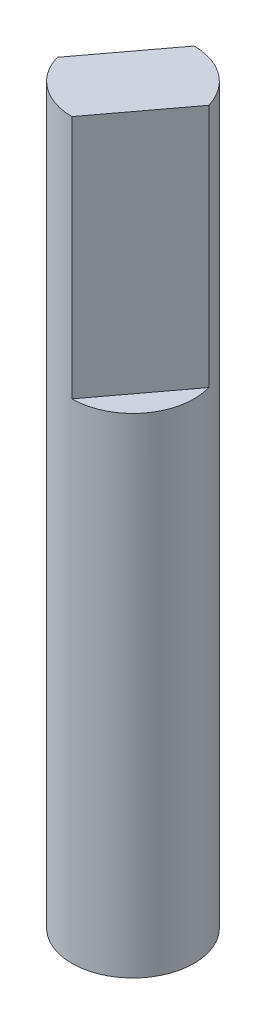
ISO-10303-21;
HEADER;
FILE_DESCRIPTION(('STEP AP214'),'2;1');
FILE_NAME('part.step','',(''),(''),'','','');
FILE_SCHEMA(('AUTOMOTIVE_DESIGN { 1 0 10303 214 1 1 1 1 }'));
ENDSEC;
DATA;
#1=APPLICATION_CONTEXT('core data for automotive mechanical design processes');
#2=APPLICATION_PROTOCOL_DEFINITION('international standard','automotive_design',2000,#1);
#3=PRODUCT_CONTEXT('',#1,'mechanical');
#4=PRODUCT('Part','Part','',(#3));
#5=PRODUCT_RELATED_PRODUCT_CATEGORY('part','',(#4));
#6=PRODUCT_DEFINITION_FORMATION('','',#4);
#7=PRODUCT_DEFINITION_CONTEXT('part definition',#1,'design');
#8=PRODUCT_DEFINITION('design','',#6,#7);
#9=PRODUCT_DEFINITION_SHAPE('','',#8);
#10=(LENGTH_UNIT() NAMED_UNIT(*) SI_UNIT(.MILLI.,.METRE.));
#11=(NAMED_UNIT(*) PLANE_ANGLE_UNIT() SI_UNIT($,.RADIAN.));
#12=(NAMED_UNIT(*) SI_UNIT($,.STERADIAN.) SOLID_ANGLE_UNIT());
#13=UNCERTAINTY_MEASURE_WITH_UNIT(LENGTH_MEASURE(1.E-05),#10,'distance_accuracy_value','');
#14=(GEOMETRIC_REPRESENTATION_CONTEXT(3) GLOBAL_UNCERTAINTY_ASSIGNED_CONTEXT((#13)) GLOBAL_UNIT_ASSIGNED_CONTEXT((#10,
#11,#12)) REPRESENTATION_CONTEXT('',''));
#15=CARTESIAN_POINT('',(0.,0.,0.));
#16=DIRECTION('',(0.,0.,1.));
#17=DIRECTION('',(1.,0.,0.));
#18=AXIS2_PLACEMENT_3D('',#15,#16,#17);
#19=CARTESIAN_POINT('',(0.,30.,0.));
#20=DIRECTION('',(0.,-1.,0.));
#21=DIRECTION('',(0.,0.,-1.));
#22=AXIS2_PLACEMENT_3D('',#19,#20,#21);
#23=CYLINDRICAL_SURFACE('',#22,2.5);
#24=CARTESIAN_POINT('',(0.,30.,0.));
#25=DIRECTION('',(0.,1.,0.));
#26=DIRECTION('',(0.,0.,1.));
#27=AXIS2_PLACEMENT_3D('',#24,#25,#26);
#28=CIRCLE('',#27,2.5);
#29=CARTESIAN_POINT('',(2.4,30.,-0.700000000000004));
#30=VERTEX_POINT('',#29);
#31=CARTESIAN_POINT('',(0.,30.,-2.5));
#32=VERTEX_POINT('',#31);
#33=EDGE_CURVE('E41',#30,#32,#28,.T.);
#34=ORIENTED_EDGE('',*,*,#33,.F.);
#35=DIRECTION('',(0.,1.,0.));
#36=VECTOR('',#35,1.);
#37=CARTESIAN_POINT('',(2.4,20.,-0.700000000000003));
#38=LINE('',#37,#36);
#39=CARTESIAN_POINT('',(2.4,20.,-0.700000000000003));
#40=VERTEX_POINT('',#39);
#41=EDGE_CURVE('E48',#40,#30,#38,.T.);
#42=ORIENTED_EDGE('',*,*,#41,.F.);
#43=CARTESIAN_POINT('',(0.,20.,0.));
#44=DIRECTION('',(0.,1.,0.));
#45=DIRECTION('',(0.,0.,1.));
#46=AXIS2_PLACEMENT_3D('',#43,#44,#45);
#47=CIRCLE('',#46,2.5);
#48=CARTESIAN_POINT('',(0.,20.,2.5));
#49=VERTEX_POINT('',#48);
#50=EDGE_CURVE('E77',#49,#40,#47,.T.);
#51=ORIENTED_EDGE('',*,*,#50,.F.);
#52=DIRECTION('',(0.,1.,0.));
#53=VECTOR('',#52,1.);
#54=CARTESIAN_POINT('',(0.,20.,2.5));
#55=LINE('',#54,#53);
#56=CARTESIAN_POINT('',(0.,30.,2.5));
#57=VERTEX_POINT('',#56);
#58=EDGE_CURVE('E85',#49,#57,#55,.T.);
#59=ORIENTED_EDGE('',*,*,#58,.T.);
#60=CARTESIAN_POINT('',(-2.4,30.,0.700000000000002));
#61=VERTEX_POINT('',#60);
#62=EDGE_CURVE('E11',#61,#57,#28,.T.);
#63=ORIENTED_EDGE('',*,*,#62,.F.);
#64=DIRECTION('',(0.,1.,0.));
#65=VECTOR('',#64,1.);
#66=CARTESIAN_POINT('',(-2.4,20.,0.700000000000003));
#67=LINE('',#66,#65);
#68=CARTESIAN_POINT('',(-2.4,20.,0.700000000000003));
#69=VERTEX_POINT('',#68);
#70=EDGE_CURVE('E56',#69,#61,#67,.T.);
#71=ORIENTED_EDGE('',*,*,#70,.F.);
#72=CARTESIAN_POINT('',(0.,20.,0.));
#73=DIRECTION('',(0.,1.,0.));
#74=DIRECTION('',(0.,0.,1.));
#75=AXIS2_PLACEMENT_3D('',#72,#73,#74);
#76=CIRCLE('',#75,2.5);
#77=CARTESIAN_POINT('',(0.,20.,-2.5));
#78=VERTEX_POINT('',#77);
#79=EDGE_CURVE('E95',#78,#69,#76,.T.);
#80=ORIENTED_EDGE('',*,*,#79,.F.);
#81=DIRECTION('',(0.,1.,0.));
#82=VECTOR('',#81,1.);
#83=CARTESIAN_POINT('',(0.,20.,-2.5));
#84=LINE('',#83,#82);
#85=EDGE_CURVE('E101',#78,#32,#84,.T.);
#86=ORIENTED_EDGE('',*,*,#85,.T.);
#87=EDGE_LOOP('',(#34,#42,#51,#59,#63,#71,#80,#86));
#88=FACE_BOUND('',#87,.T.);
#89=CARTESIAN_POINT('',(0.,0.,0.));
#90=DIRECTION('',(0.,1.,0.));
#91=DIRECTION('',(0.,0.,1.));
#92=AXIS2_PLACEMENT_3D('',#89,#90,#91);
#93=CIRCLE('',#92,2.5);
#94=CARTESIAN_POINT('',(0.,0.,2.5));
#95=VERTEX_POINT('',#94);
#96=EDGE_CURVE('E36',#95,#95,#93,.T.);
#97=ORIENTED_EDGE('',*,*,#96,.T.);
#98=EDGE_LOOP('',(#97));
#99=FACE_BOUND('',#98,.T.);
#100=ADVANCED_FACE('F33',(#88,#99),#23,.T.);
#101=CARTESIAN_POINT('',(0.,30.,0.));
#102=DIRECTION('',(0.,1.,0.));
#103=DIRECTION('',(0.,0.,1.));
#104=AXIS2_PLACEMENT_3D('',#101,#102,#103);
#105=PLANE('',#104);
#106=DIRECTION('',(-0.599999999999999,0.,0.8));
#107=VECTOR('',#106,1.);
#108=CARTESIAN_POINT('',(0.,30.,2.5));
#109=LINE('',#108,#107);
#110=EDGE_CURVE('E82',#30,#57,#109,.T.);
#111=ORIENTED_EDGE('',*,*,#110,.F.);
#112=ORIENTED_EDGE('',*,*,#33,.T.);
#113=DIRECTION('',(0.6,0.,-0.8));
#114=VECTOR('',#113,1.);
#115=CARTESIAN_POINT('',(0.,30.,-2.5));
#116=LINE('',#115,#114);
#117=EDGE_CURVE('E91',#61,#32,#116,.T.);
#118=ORIENTED_EDGE('',*,*,#117,.F.);
#119=ORIENTED_EDGE('',*,*,#62,.T.);
#120=EDGE_LOOP('',(#111,#112,#118,#119));
#121=FACE_BOUND('',#120,.T.);
#122=ADVANCED_FACE('F107',(#121),#105,.T.);
#123=CARTESIAN_POINT('',(0.,0.,0.));
#124=DIRECTION('',(0.,1.,0.));
#125=DIRECTION('',(0.,0.,1.));
#126=AXIS2_PLACEMENT_3D('',#123,#124,#125);
#127=PLANE('',#126);
#128=ORIENTED_EDGE('',*,*,#96,.F.);
#129=EDGE_LOOP('',(#128));
#130=FACE_BOUND('',#129,.T.);
#131=ADVANCED_FACE('F119',(#130),#127,.F.);
#132=CARTESIAN_POINT('',(0.,20.,-2.5));
#133=DIRECTION('',(0.8,0.,0.6));
#134=DIRECTION('',(0.6,0.,-0.8));
#135=AXIS2_PLACEMENT_3D('',#132,#133,#134);
#136=PLANE('',#135);
#137=ORIENTED_EDGE('',*,*,#117,.T.);
#138=ORIENTED_EDGE('',*,*,#85,.F.);
#139=DIRECTION('',(0.6,0.,-0.8));
#140=VECTOR('',#139,1.);
#141=CARTESIAN_POINT('',(0.,20.,-2.5));
#142=LINE('',#141,#140);
#143=EDGE_CURVE('E97',#69,#78,#142,.T.);
#144=ORIENTED_EDGE('',*,*,#143,.F.);
#145=ORIENTED_EDGE('',*,*,#70,.T.);
#146=EDGE_LOOP('',(#137,#138,#144,#145));
#147=FACE_BOUND('',#146,.T.);
#148=ADVANCED_FACE('F109',(#147),#136,.F.);
#149=CARTESIAN_POINT('',(0.,20.,0.));
#150=DIRECTION('',(0.,1.,0.));
#151=DIRECTION('',(0.,0.,1.));
#152=AXIS2_PLACEMENT_3D('',#149,#150,#151);
#153=PLANE('',#152);
#154=ORIENTED_EDGE('',*,*,#79,.T.);
#155=ORIENTED_EDGE('',*,*,#143,.T.);
#156=EDGE_LOOP('',(#154,#155));
#157=FACE_BOUND('',#156,.T.);
#158=ADVANCED_FACE('F111',(#157),#153,.T.);
#159=CARTESIAN_POINT('',(0.,20.,2.5));
#160=DIRECTION('',(-0.8,0.,-0.599999999999999));
#161=DIRECTION('',(-0.599999999999999,0.,0.8));
#162=AXIS2_PLACEMENT_3D('',#159,#160,#161);
#163=PLANE('',#162);
#164=ORIENTED_EDGE('',*,*,#110,.T.);
#165=ORIENTED_EDGE('',*,*,#58,.F.);
#166=DIRECTION('',(-0.599999999999999,0.,0.8));
#167=VECTOR('',#166,1.);
#168=CARTESIAN_POINT('',(0.,20.,2.5));
#169=LINE('',#168,#167);
#170=EDGE_CURVE('E79',#40,#49,#169,.T.);
#171=ORIENTED_EDGE('',*,*,#170,.F.);
#172=ORIENTED_EDGE('',*,*,#41,.T.);
#173=EDGE_LOOP('',(#164,#165,#171,#172));
#174=FACE_BOUND('',#173,.T.);
#175=ADVANCED_FACE('F84',(#174),#163,.F.);
#176=CARTESIAN_POINT('',(0.,20.,0.));
#177=DIRECTION('',(0.,1.,0.));
#178=DIRECTION('',(0.,0.,1.));
#179=AXIS2_PLACEMENT_3D('',#176,#177,#178);
#180=PLANE('',#179);
#181=ORIENTED_EDGE('',*,*,#50,.T.);
#182=ORIENTED_EDGE('',*,*,#170,.T.);
#183=EDGE_LOOP('',(#181,#182));
#184=FACE_BOUND('',#183,.T.);
#185=ADVANCED_FACE('F78',(#184),#180,.T.);
#186=CLOSED_SHELL('',(#100,#122,#131,#148,#158,#175,#185));
#187=MANIFOLD_SOLID_BREP('B2',#186);
#188=ADVANCED_BREP_SHAPE_REPRESENTATION('',(#18,#187),#14);
#189=SHAPE_DEFINITION_REPRESENTATION(#9,#188);
ENDSEC;
END-ISO-10303-21;
